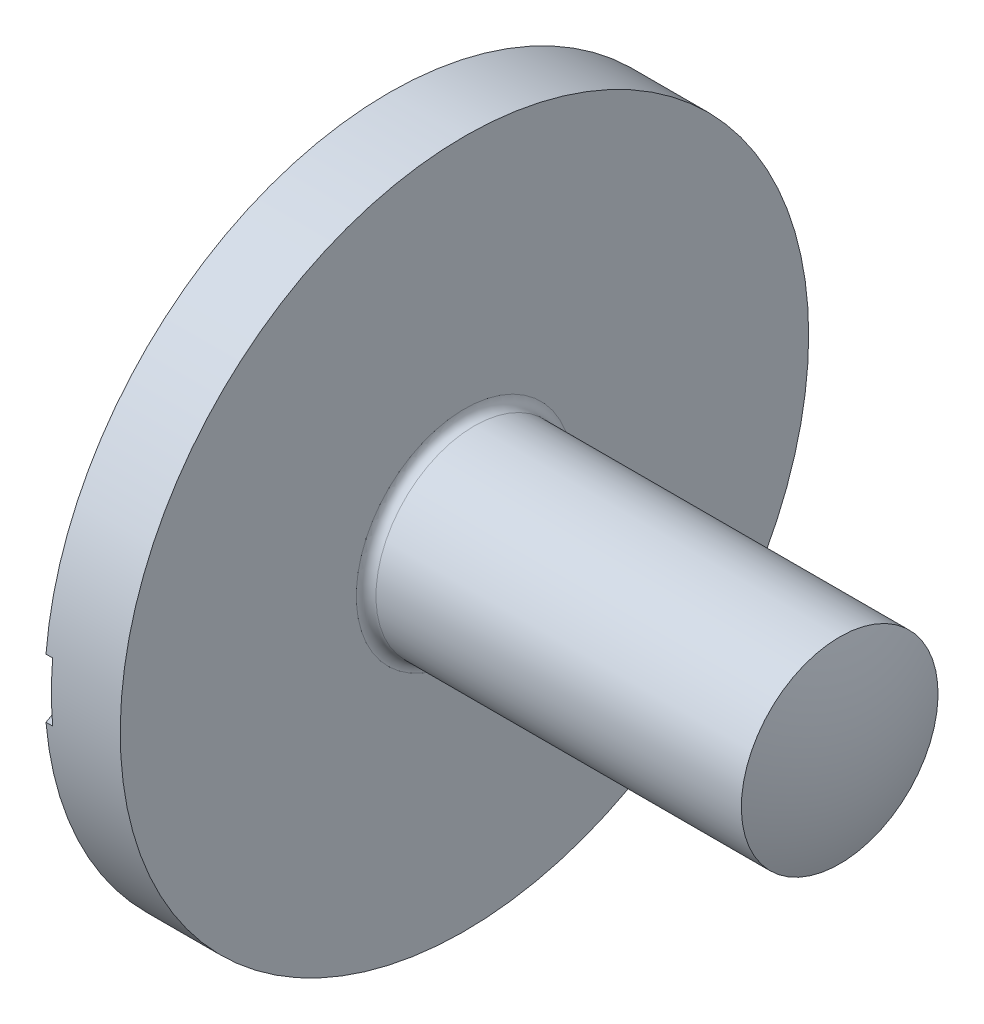
ISO-10303-21;
HEADER;
FILE_DESCRIPTION(('STEP AP214'),'2;1');
FILE_NAME('part.step','',(''),(''),'','','');
FILE_SCHEMA(('AUTOMOTIVE_DESIGN { 1 0 10303 214 1 1 1 1 }'));
ENDSEC;
DATA;
#1=APPLICATION_CONTEXT('core data for automotive mechanical design processes');
#2=APPLICATION_PROTOCOL_DEFINITION('international standard','automotive_design',2000,#1);
#3=PRODUCT_CONTEXT('',#1,'mechanical');
#4=PRODUCT('Part','Part','',(#3));
#5=PRODUCT_RELATED_PRODUCT_CATEGORY('part','',(#4));
#6=PRODUCT_DEFINITION_FORMATION('','',#4);
#7=PRODUCT_DEFINITION_CONTEXT('part definition',#1,'design');
#8=PRODUCT_DEFINITION('design','',#6,#7);
#9=PRODUCT_DEFINITION_SHAPE('','',#8);
#10=(LENGTH_UNIT() NAMED_UNIT(*) SI_UNIT(.MILLI.,.METRE.));
#11=(NAMED_UNIT(*) PLANE_ANGLE_UNIT() SI_UNIT($,.RADIAN.));
#12=(NAMED_UNIT(*) SI_UNIT($,.STERADIAN.) SOLID_ANGLE_UNIT());
#13=UNCERTAINTY_MEASURE_WITH_UNIT(LENGTH_MEASURE(1.E-05),#10,'distance_accuracy_value','');
#14=(GEOMETRIC_REPRESENTATION_CONTEXT(3) GLOBAL_UNCERTAINTY_ASSIGNED_CONTEXT((#13)) GLOBAL_UNIT_ASSIGNED_CONTEXT((#10,
#11,#12)) REPRESENTATION_CONTEXT('',''));
#15=CARTESIAN_POINT('',(0.,0.,0.));
#16=DIRECTION('',(0.,0.,1.));
#17=DIRECTION('',(1.,0.,0.));
#18=AXIS2_PLACEMENT_3D('',#15,#16,#17);
#19=CARTESIAN_POINT('',(2.8,0.,0.));
#20=DIRECTION('',(1.,0.,0.));
#21=DIRECTION('',(0.,0.,-1.));
#22=AXIS2_PLACEMENT_3D('',#19,#20,#21);
#23=PLANE('',#22);
#24=CARTESIAN_POINT('',(2.8,0.,0.));
#25=DIRECTION('',(1.,0.,0.));
#26=DIRECTION('',(0.,0.,-1.));
#27=AXIS2_PLACEMENT_3D('',#24,#25,#26);
#28=CIRCLE('',#27,2.2);
#29=CARTESIAN_POINT('',(2.8,0.,-2.2));
#30=VERTEX_POINT('',#29);
#31=EDGE_CURVE('E11',#30,#30,#28,.F.);
#32=ORIENTED_EDGE('',*,*,#31,.T.);
#33=EDGE_LOOP('',(#32));
#34=FACE_BOUND('',#33,.T.);
#35=CARTESIAN_POINT('',(2.8,0.,0.));
#36=DIRECTION('',(1.,0.,0.));
#37=DIRECTION('',(0.,0.,-1.));
#38=AXIS2_PLACEMENT_3D('',#35,#36,#37);
#39=CIRCLE('',#38,7.);
#40=CARTESIAN_POINT('',(2.8,0.,-7.));
#41=VERTEX_POINT('',#40);
#42=EDGE_CURVE('E99',#41,#41,#39,.T.);
#43=ORIENTED_EDGE('',*,*,#42,.T.);
#44=EDGE_LOOP('',(#43));
#45=FACE_BOUND('',#44,.T.);
#46=ADVANCED_FACE('F37',(#34,#45),#23,.T.);
#47=CARTESIAN_POINT('',(2.8,0.,0.));
#48=DIRECTION('',(-1.,0.,0.));
#49=DIRECTION('',(0.,0.,1.));
#50=AXIS2_PLACEMENT_3D('',#47,#48,#49);
#51=CYLINDRICAL_SURFACE('',#50,7.);
#52=ORIENTED_EDGE('',*,*,#42,.F.);
#53=EDGE_LOOP('',(#52));
#54=FACE_BOUND('',#53,.T.);
#55=DIRECTION('',(-1.,0.,0.));
#56=VECTOR('',#55,1.);
#57=CARTESIAN_POINT('',(2.8,0.6,-6.97423830966508));
#58=LINE('',#57,#56);
#59=CARTESIAN_POINT('',(1.4,0.6,-6.97423830966508));
#60=VERTEX_POINT('',#59);
#61=CARTESIAN_POINT('',(1.2650060048048,0.6,-6.97423830966508));
#62=VERTEX_POINT('',#61);
#63=EDGE_CURVE('E91',#60,#62,#58,.T.);
#64=ORIENTED_EDGE('',*,*,#63,.T.);
#65=CARTESIAN_POINT('',(1.26500600480481,0.,0.));
#66=DIRECTION('',(1.,0.,0.));
#67=DIRECTION('',(0.,1.,0.));
#68=AXIS2_PLACEMENT_3D('',#65,#66,#67);
#69=CIRCLE('',#68,7.);
#70=CARTESIAN_POINT('',(1.26500600480481,0.599999999999998,6.97423830966508));
#71=VERTEX_POINT('',#70);
#72=EDGE_CURVE('E51',#62,#71,#69,.T.);
#73=ORIENTED_EDGE('',*,*,#72,.T.);
#74=DIRECTION('',(-1.,0.,0.));
#75=VECTOR('',#74,1.);
#76=CARTESIAN_POINT('',(2.8,0.6,6.97423830966508));
#77=LINE('',#76,#75);
#78=CARTESIAN_POINT('',(1.4,0.6,6.97423830966508));
#79=VERTEX_POINT('',#78);
#80=EDGE_CURVE('E88',#71,#79,#77,.F.);
#81=ORIENTED_EDGE('',*,*,#80,.T.);
#82=CARTESIAN_POINT('',(1.4,0.,0.));
#83=DIRECTION('',(1.,0.,0.));
#84=DIRECTION('',(0.,1.,0.));
#85=AXIS2_PLACEMENT_3D('',#82,#83,#84);
#86=CIRCLE('',#85,7.);
#87=CARTESIAN_POINT('',(1.4,-0.6,6.97423830966508));
#88=VERTEX_POINT('',#87);
#89=EDGE_CURVE('E109',#79,#88,#86,.T.);
#90=ORIENTED_EDGE('',*,*,#89,.T.);
#91=DIRECTION('',(-1.,0.,0.));
#92=VECTOR('',#91,1.);
#93=CARTESIAN_POINT('',(2.8,-0.6,6.97423830966508));
#94=LINE('',#93,#92);
#95=CARTESIAN_POINT('',(1.2650060048048,-0.6,6.97423830966508));
#96=VERTEX_POINT('',#95);
#97=EDGE_CURVE('E97',#88,#96,#94,.T.);
#98=ORIENTED_EDGE('',*,*,#97,.T.);
#99=CARTESIAN_POINT('',(1.26500600480481,-0.600000000000004,-6.97423830966507));
#100=VERTEX_POINT('',#99);
#101=EDGE_CURVE('E58',#96,#100,#69,.T.);
#102=ORIENTED_EDGE('',*,*,#101,.T.);
#103=DIRECTION('',(-1.,0.,0.));
#104=VECTOR('',#103,1.);
#105=CARTESIAN_POINT('',(2.8,-0.6,-6.97423830966508));
#106=LINE('',#105,#104);
#107=CARTESIAN_POINT('',(1.4,-0.6,-6.97423830966508));
#108=VERTEX_POINT('',#107);
#109=EDGE_CURVE('E102',#100,#108,#106,.F.);
#110=ORIENTED_EDGE('',*,*,#109,.T.);
#111=EDGE_CURVE('E111',#108,#60,#86,.T.);
#112=ORIENTED_EDGE('',*,*,#111,.T.);
#113=EDGE_LOOP('',(#64,#73,#81,#90,#98,#102,#110,#112));
#114=FACE_BOUND('',#113,.T.);
#115=ADVANCED_FACE('F86',(#54,#114),#51,.T.);
#116=CARTESIAN_POINT('',(10.8000000000081,0.,0.));
#117=DIRECTION('',(-1.,0.,0.));
#118=DIRECTION('',(0.,0.,1.));
#119=AXIS2_PLACEMENT_3D('',#116,#117,#118);
#120=CYLINDRICAL_SURFACE('',#119,2.);
#121=CARTESIAN_POINT('',(3.,0.,0.));
#122=DIRECTION('',(1.,0.,0.));
#123=DIRECTION('',(0.,0.,-1.));
#124=AXIS2_PLACEMENT_3D('',#121,#122,#123);
#125=CIRCLE('',#124,2.);
#126=CARTESIAN_POINT('',(3.,0.,-2.));
#127=VERTEX_POINT('',#126);
#128=EDGE_CURVE('E45',#127,#127,#125,.T.);
#129=ORIENTED_EDGE('',*,*,#128,.T.);
#130=EDGE_LOOP('',(#129));
#131=FACE_BOUND('',#130,.T.);
#132=CARTESIAN_POINT('',(10.4306787322569,0.,0.));
#133=DIRECTION('',(1.,0.,0.));
#134=DIRECTION('',(0.,1.,0.));
#135=AXIS2_PLACEMENT_3D('',#132,#133,#134);
#136=CIRCLE('',#135,1.99999999999999);
#137=CARTESIAN_POINT('',(10.4306787322569,2.,0.));
#138=VERTEX_POINT('',#137);
#139=EDGE_CURVE('E83',#138,#138,#136,.T.);
#140=ORIENTED_EDGE('',*,*,#139,.F.);
#141=EDGE_LOOP('',(#140));
#142=FACE_BOUND('',#141,.T.);
#143=ADVANCED_FACE('F116',(#131,#142),#120,.T.);
#144=CARTESIAN_POINT('',(1.4,0.6,-7.));
#145=DIRECTION('',(1.,0.,0.));
#146=DIRECTION('',(0.,1.,0.));
#147=AXIS2_PLACEMENT_3D('',#144,#145,#146);
#148=PLANE('',#147);
#149=DIRECTION('',(0.,0.,1.));
#150=VECTOR('',#149,1.);
#151=CARTESIAN_POINT('',(1.4,0.6,-7.));
#152=LINE('',#151,#150);
#153=EDGE_CURVE('E96',#60,#79,#152,.T.);
#154=ORIENTED_EDGE('',*,*,#153,.F.);
#155=ORIENTED_EDGE('',*,*,#111,.F.);
#156=DIRECTION('',(0.,0.,1.));
#157=VECTOR('',#156,1.);
#158=CARTESIAN_POINT('',(1.4,-0.6,-7.));
#159=LINE('',#158,#157);
#160=EDGE_CURVE('E157',#108,#88,#159,.T.);
#161=ORIENTED_EDGE('',*,*,#160,.T.);
#162=ORIENTED_EDGE('',*,*,#89,.F.);
#163=EDGE_LOOP('',(#154,#155,#161,#162));
#164=FACE_BOUND('',#163,.T.);
#165=ADVANCED_FACE('F138',(#164),#148,.F.);
#166=CARTESIAN_POINT('',(0.,0.6,-7.));
#167=DIRECTION('',(0.,1.,0.));
#168=DIRECTION('',(-1.,0.,0.));
#169=AXIS2_PLACEMENT_3D('',#166,#167,#168);
#170=PLANE('',#169);
#171=ORIENTED_EDGE('',*,*,#80,.F.);
#172=CARTESIAN_POINT('',(20.,0.600000000000003,0.));
#173=DIRECTION('',(0.,1.,0.));
#174=DIRECTION('',(-1.,0.,0.));
#175=AXIS2_PLACEMENT_3D('',#172,#173,#174);
#176=CIRCLE('',#175,19.9909979740882);
#177=EDGE_CURVE('E78',#71,#62,#176,.F.);
#178=ORIENTED_EDGE('',*,*,#177,.T.);
#179=ORIENTED_EDGE('',*,*,#63,.F.);
#180=ORIENTED_EDGE('',*,*,#153,.T.);
#181=EDGE_LOOP('',(#171,#178,#179,#180));
#182=FACE_BOUND('',#181,.T.);
#183=ADVANCED_FACE('F94',(#182),#170,.F.);
#184=CARTESIAN_POINT('',(0.,-0.6,-7.));
#185=DIRECTION('',(0.,-1.,0.));
#186=DIRECTION('',(1.,0.,0.));
#187=AXIS2_PLACEMENT_3D('',#184,#185,#186);
#188=PLANE('',#187);
#189=ORIENTED_EDGE('',*,*,#109,.F.);
#190=CARTESIAN_POINT('',(20.,-0.600000000000001,0.));
#191=DIRECTION('',(0.,-1.,0.));
#192=DIRECTION('',(1.,0.,0.));
#193=AXIS2_PLACEMENT_3D('',#190,#191,#192);
#194=CIRCLE('',#193,19.9909979740882);
#195=EDGE_CURVE('E112',#100,#96,#194,.F.);
#196=ORIENTED_EDGE('',*,*,#195,.T.);
#197=ORIENTED_EDGE('',*,*,#97,.F.);
#198=ORIENTED_EDGE('',*,*,#160,.F.);
#199=EDGE_LOOP('',(#189,#196,#197,#198));
#200=FACE_BOUND('',#199,.T.);
#201=ADVANCED_FACE('F139',(#200),#188,.F.);
#202=CARTESIAN_POINT('',(5.20000000000809,0.,0.));
#203=DIRECTION('',(1.,0.,0.));
#204=DIRECTION('',(0.,1.,0.));
#205=AXIS2_PLACEMENT_3D('',#202,#203,#204);
#206=SPHERICAL_SURFACE('',#205,5.6);
#207=CARTESIAN_POINT('',(10.8000000000081,0.,0.));
#208=VERTEX_POINT('',#207);
#209=VERTEX_LOOP('',#208);
#210=FACE_BOUND('',#209,.T.);
#211=ORIENTED_EDGE('',*,*,#139,.T.);
#212=EDGE_LOOP('',(#211));
#213=FACE_BOUND('',#212,.T.);
#214=ADVANCED_FACE('F142',(#210,#213),#206,.T.);
#215=CARTESIAN_POINT('',(20.,0.,0.));
#216=DIRECTION('',(1.,0.,0.));
#217=DIRECTION('',(0.,1.,0.));
#218=AXIS2_PLACEMENT_3D('',#215,#216,#217);
#219=SPHERICAL_SURFACE('',#218,20.);
#220=ORIENTED_EDGE('',*,*,#101,.F.);
#221=ORIENTED_EDGE('',*,*,#195,.F.);
#222=EDGE_LOOP('',(#220,#221));
#223=FACE_BOUND('',#222,.T.);
#224=ADVANCED_FACE('F124',(#223),#219,.T.);
#225=ORIENTED_EDGE('',*,*,#72,.F.);
#226=ORIENTED_EDGE('',*,*,#177,.F.);
#227=EDGE_LOOP('',(#225,#226));
#228=FACE_BOUND('',#227,.T.);
#229=ADVANCED_FACE('F79',(#228),#219,.T.);
#230=CARTESIAN_POINT('',(3.,0.,0.));
#231=DIRECTION('',(1.,0.,0.));
#232=DIRECTION('',(0.,0.,-1.));
#233=AXIS2_PLACEMENT_3D('',#230,#231,#232);
#234=TOROIDAL_SURFACE('',#233,2.2,0.2);
#235=ORIENTED_EDGE('',*,*,#31,.F.);
#236=EDGE_LOOP('',(#235));
#237=FACE_BOUND('',#236,.T.);
#238=ORIENTED_EDGE('',*,*,#128,.F.);
#239=EDGE_LOOP('',(#238));
#240=FACE_BOUND('',#239,.T.);
#241=ADVANCED_FACE('F39',(#237,#240),#234,.F.);
#242=CLOSED_SHELL('',(#46,#115,#143,#165,#183,#201,#214,#224,#229,#241));
#243=MANIFOLD_SOLID_BREP('B2',#242);
#244=ADVANCED_BREP_SHAPE_REPRESENTATION('',(#18,#243),#14);
#245=SHAPE_DEFINITION_REPRESENTATION(#9,#244);
ENDSEC;
END-ISO-10303-21;
